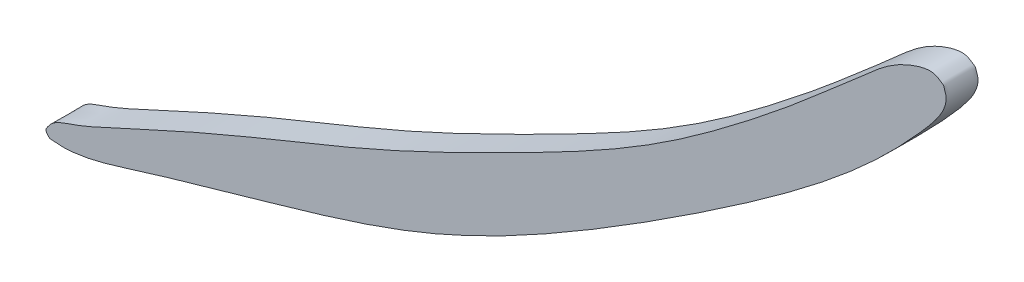
ISO-10303-21;
HEADER;
FILE_DESCRIPTION(('STEP AP214'),'2;1');
FILE_NAME('part.step','',(''),(''),'','','');
FILE_SCHEMA(('AUTOMOTIVE_DESIGN { 1 0 10303 214 1 1 1 1 }'));
ENDSEC;
DATA;
#1=APPLICATION_CONTEXT('core data for automotive mechanical design processes');
#2=APPLICATION_PROTOCOL_DEFINITION('international standard','automotive_design',2000,#1);
#3=PRODUCT_CONTEXT('',#1,'mechanical');
#4=PRODUCT('Part','Part','',(#3));
#5=PRODUCT_RELATED_PRODUCT_CATEGORY('part','',(#4));
#6=PRODUCT_DEFINITION_FORMATION('','',#4);
#7=PRODUCT_DEFINITION_CONTEXT('part definition',#1,'design');
#8=PRODUCT_DEFINITION('design','',#6,#7);
#9=PRODUCT_DEFINITION_SHAPE('','',#8);
#10=(LENGTH_UNIT() NAMED_UNIT(*) SI_UNIT(.MILLI.,.METRE.));
#11=(NAMED_UNIT(*) PLANE_ANGLE_UNIT() SI_UNIT($,.RADIAN.));
#12=(NAMED_UNIT(*) SI_UNIT($,.STERADIAN.) SOLID_ANGLE_UNIT());
#13=UNCERTAINTY_MEASURE_WITH_UNIT(LENGTH_MEASURE(1.E-05),#10,'distance_accuracy_value','');
#14=(GEOMETRIC_REPRESENTATION_CONTEXT(3) GLOBAL_UNCERTAINTY_ASSIGNED_CONTEXT((#13)) GLOBAL_UNIT_ASSIGNED_CONTEXT((#10,
#11,#12)) REPRESENTATION_CONTEXT('',''));
#15=CARTESIAN_POINT('',(0.,0.,0.));
#16=DIRECTION('',(0.,0.,1.));
#17=DIRECTION('',(1.,0.,0.));
#18=AXIS2_PLACEMENT_3D('',#15,#16,#17);
#19=CARTESIAN_POINT('',(-123.346581771939,-122.23914203334,116.));
#20=CARTESIAN_POINT('',(-123.350670343101,-122.327703271514,116.));
#21=CARTESIAN_POINT('',(-123.336388516588,-122.411762130704,116.));
#22=CARTESIAN_POINT('',(-123.287464628301,-122.576831523646,116.));
#23=CARTESIAN_POINT('',(-123.253093486007,-122.65539031784,116.));
#24=CARTESIAN_POINT('',(-123.173885785859,-122.80830883089,116.));
#25=CARTESIAN_POINT('',(-123.129447112048,-122.882204227449,116.));
#26=CARTESIAN_POINT('',(-123.036707190821,-123.02695455236,116.));
#27=CARTESIAN_POINT('',(-122.988741334589,-123.098289940944,116.));
#28=CARTESIAN_POINT('',(-122.834851360942,-123.305785755107,116.));
#29=CARTESIAN_POINT('',(-122.721297936182,-123.436081940772,116.));
#30=CARTESIAN_POINT('',(-122.434997912115,-123.631298713097,116.));
#31=CARTESIAN_POINT('',(-122.265674632005,-123.678189608886,116.));
#32=CARTESIAN_POINT('',(-121.924883098179,-123.717548437132,116.));
#33=CARTESIAN_POINT('',(-121.752270603344,-123.718239099941,116.));
#34=CARTESIAN_POINT('',(-121.408358842271,-123.73066184266,116.));
#35=CARTESIAN_POINT('',(-121.236576322802,-123.740488667375,116.));
#36=CARTESIAN_POINT('',(-120.721475103336,-123.77510655191,116.));
#37=CARTESIAN_POINT('',(-120.378627969949,-123.805971108741,116.));
#38=CARTESIAN_POINT('',(-119.691974420407,-123.854482816524,116.));
#39=CARTESIAN_POINT('',(-119.348198733799,-123.869022894388,116.));
#40=CARTESIAN_POINT('',(-118.660925144626,-123.87015771514,116.));
#41=CARTESIAN_POINT('',(-118.317073389005,-123.859046888251,116.));
#42=CARTESIAN_POINT('',(-117.28673570928,-123.801370532143,116.));
#43=CARTESIAN_POINT('',(-116.602703619699,-123.732486508648,116.));
#44=CARTESIAN_POINT('',(-114.554559908244,-123.483771012516,116.));
#45=CARTESIAN_POINT('',(-113.198845914573,-123.251110754615,116.));
#46=CARTESIAN_POINT('',(-110.512016833612,-122.660235640272,116.));
#47=CARTESIAN_POINT('',(-109.184764856665,-122.305605328689,116.));
#48=CARTESIAN_POINT('',(-106.541294125532,-121.555937325594,116.));
#49=CARTESIAN_POINT('',(-105.225646529032,-121.158628308524,116.));
#50=CARTESIAN_POINT('',(-102.596628573702,-120.356524905198,116.));
#51=CARTESIAN_POINT('',(-101.283536397662,-119.950853856829,116.));
#52=CARTESIAN_POINT('',(-97.3441452776747,-118.734212578666,116.));
#53=CARTESIAN_POINT('',(-94.7162362781622,-117.928287131128,116.));
#54=CARTESIAN_POINT('',(-81.549164173435,-113.991081891313,116.));
#55=CARTESIAN_POINT('',(-70.9379279472959,-111.104289211834,116.));
#56=CARTESIAN_POINT('',(-55.1142568095192,-106.465629398409,116.));
#57=CARTESIAN_POINT('',(-49.8556322882397,-104.867574970996,116.));
#58=CARTESIAN_POINT('',(-42.0291065031374,-102.27070028095,116.));
#59=CARTESIAN_POINT('',(-39.4306287812687,-101.371356725992,116.));
#60=CARTESIAN_POINT('',(-34.2608577594214,-99.4842284766356,116.));
#61=CARTESIAN_POINT('',(-31.6929906236804,-98.4968024491772,116.));
#62=CARTESIAN_POINT('',(-26.599613025675,-96.4285334967114,116.));
#63=CARTESIAN_POINT('',(-24.0733382933696,-95.347323859828,116.));
#64=CARTESIAN_POINT('',(-19.0600165065119,-93.094444940783,116.));
#65=CARTESIAN_POINT('',(-16.5728687351835,-91.9230079130995,116.));
#66=CARTESIAN_POINT('',(-11.6326800832874,-89.5014828282418,116.));
#67=CARTESIAN_POINT('',(-9.18055266770574,-88.252098211809,116.));
#68=CARTESIAN_POINT('',(-4.31220912328322,-85.692445435984,116.));
#69=CARTESIAN_POINT('',(-1.89492991195997,-84.3817720636148,116.));
#70=CARTESIAN_POINT('',(5.31414605134367,-80.3716661785096,116.));
#71=CARTESIAN_POINT('',(10.0652562688566,-77.5938334129924,116.));
#72=CARTESIAN_POINT('',(19.4840933609413,-71.9108196641323,116.));
#73=CARTESIAN_POINT('',(24.1503159816519,-69.0023595271135,116.));
#74=CARTESIAN_POINT('',(33.4146540563922,-63.0798738095772,116.));
#75=CARTESIAN_POINT('',(38.0137479963899,-60.0673648727584,116.));
#76=CARTESIAN_POINT('',(44.8633306807719,-55.4725616967299,116.));
#77=CARTESIAN_POINT('',(47.1382528947039,-53.9281390968016,116.));
#78=CARTESIAN_POINT('',(51.669100973916,-50.809849741976,116.));
#79=CARTESIAN_POINT('',(53.9255813178719,-49.2353229692718,116.));
#80=CARTESIAN_POINT('',(60.6508910223398,-44.4604403235639,116.));
#81=CARTESIAN_POINT('',(65.0788666773657,-41.2105782349411,116.));
#82=CARTESIAN_POINT('',(73.7406382237729,-34.4780829212687,116.));
#83=CARTESIAN_POINT('',(77.9719874357884,-30.9925167627059,116.));
#84=CARTESIAN_POINT('',(84.0810278104936,-25.4788871459378,116.));
#85=CARTESIAN_POINT('',(86.0779875164423,-23.593795714443,116.));
#86=CARTESIAN_POINT('',(89.9887457354067,-19.7239241659676,116.));
#87=CARTESIAN_POINT('',(91.9034816866435,-17.736769459996,116.));
#88=CARTESIAN_POINT('',(94.7140291735318,-14.6940828435966,116.));
#89=CARTESIAN_POINT('',(95.6414242492991,-13.6719987139001,116.));
#90=CARTESIAN_POINT('',(97.0101142089785,-12.1202584928693,116.));
#91=CARTESIAN_POINT('',(97.4630114214409,-11.6002426009153,116.));
#92=CARTESIAN_POINT('',(98.357243463853,-10.5506038081857,116.));
#93=CARTESIAN_POINT('',(98.7985931901557,-10.0209932845646,116.));
#94=CARTESIAN_POINT('',(99.6578682556959,-8.94230926825586,116.));
#95=CARTESIAN_POINT('',(100.077393779527,-8.39456534475486,116.));
#96=CARTESIAN_POINT('',(100.675738563885,-7.54723897202339,116.));
#97=CARTESIAN_POINT('',(100.869730139774,-7.26026297024299,116.));
#98=CARTESIAN_POINT('',(101.242514588653,-6.67368259422813,116.));
#99=CARTESIAN_POINT('',(101.421781904919,-6.37329795197232,116.));
#100=CARTESIAN_POINT('',(101.922969415348,-5.45849154003903,116.));
#101=CARTESIAN_POINT('',(102.209044058249,-4.82773522568489,116.));
#102=CARTESIAN_POINT('',(102.521924590601,-3.83108007929206,116.));
#103=CARTESIAN_POINT('',(102.607907298514,-3.48912428143059,116.));
#104=CARTESIAN_POINT('',(102.716281198935,-2.80340583972635,116.));
#105=CARTESIAN_POINT('',(102.740461684608,-2.45772674820018,116.));
#106=CARTESIAN_POINT('',(102.69049753289,-1.93110415019487,116.));
#107=CARTESIAN_POINT('',(102.657562147584,-1.75699665338924,116.));
#108=CARTESIAN_POINT('',(102.568933615985,-1.41790010971189,116.));
#109=CARTESIAN_POINT('',(102.513165539954,-1.25156339762478,116.));
#110=CARTESIAN_POINT('',(102.398992618676,-0.919629303133802,116.));
#111=CARTESIAN_POINT('',(102.343247609362,-0.753286123317557,116.));
#112=CARTESIAN_POINT('',(102.270241151147,-0.50079609567503,116.));
#113=CARTESIAN_POINT('',(102.246813766136,-0.416366171231397,116.));
#114=CARTESIAN_POINT('',(102.198735935725,-0.247906972511253,116.));
#115=CARTESIAN_POINT('',(102.173679119711,-0.16403586766099,116.));
#116=CARTESIAN_POINT('',(102.10477226912,-0.00291244205729064,116.));
#117=CARTESIAN_POINT('',(102.059084153302,0.0733705355731589,116.));
#118=CARTESIAN_POINT('',(101.94641318996,0.205086146646933,116.));
#119=CARTESIAN_POINT('',(101.879881681318,0.263340934956862,116.));
#120=CARTESIAN_POINT('',(101.671476302958,0.422465288487987,116.));
#121=CARTESIAN_POINT('',(101.522391185208,0.513482365110699,116.));
#122=CARTESIAN_POINT('',(101.226731768766,0.699244033254578,116.));
#123=CARTESIAN_POINT('',(101.08096751975,0.795334725475329,116.));
#124=CARTESIAN_POINT('',(100.78576295919,0.981321147013895,116.));
#125=CARTESIAN_POINT('',(100.635820826836,1.07023489922442,116.));
#126=CARTESIAN_POINT('',(100.328219137469,1.23460731628296,116.));
#127=CARTESIAN_POINT('',(100.16933118882,1.31081998955095,116.));
#128=CARTESIAN_POINT('',(99.8448643301852,1.43200785428351,116.));
#129=CARTESIAN_POINT('',(99.6793521984889,1.47770856542459,116.));
#130=CARTESIAN_POINT('',(99.1742426514521,1.57586789959678,116.));
#131=CARTESIAN_POINT('',(98.8231454750102,1.58996918045501,116.));
#132=CARTESIAN_POINT('',(98.1319305510002,1.56258910020187,116.));
#133=CARTESIAN_POINT('',(97.7890910372581,1.52150123298196,116.));
#134=CARTESIAN_POINT('',(97.1060678287052,1.41303755492492,116.));
#135=CARTESIAN_POINT('',(96.7655720443355,1.34270270373661,116.));
#136=CARTESIAN_POINT('',(95.7611814020566,1.09472292237353,116.));
#137=CARTESIAN_POINT('',(95.1080838506964,0.884365625549629,116.));
#138=CARTESIAN_POINT('',(93.8188001618763,0.417480012913218,116.));
#139=CARTESIAN_POINT('',(93.1841307739104,0.156810714560129,116.));
#140=CARTESIAN_POINT('',(91.9319492862757,-0.411370179805628,116.));
#141=CARTESIAN_POINT('',(91.3126790679563,-0.719931069822434,116.));
#142=CARTESIAN_POINT('',(90.107733711017,-1.37733356436989,116.));
#143=CARTESIAN_POINT('',(89.5206719276991,-1.72689423541155,116.));
#144=CARTESIAN_POINT('',(87.8055917078289,-2.8379818672111,116.));
#145=CARTESIAN_POINT('',(86.7226821422981,-3.66056595976179,116.));
#146=CARTESIAN_POINT('',(84.6175483386729,-5.38787479594283,116.));
#147=CARTESIAN_POINT('',(83.5954213062433,-6.29273111234233,116.));
#148=CARTESIAN_POINT('',(81.5593292380886,-8.11349141929519,116.));
#149=CARTESIAN_POINT('',(80.5424706408766,-9.02543623577969,116.));
#150=CARTESIAN_POINT('',(78.4927219372392,-10.8308182624379,116.));
#151=CARTESIAN_POINT('',(77.4587935291318,-11.723167411233,116.));
#152=CARTESIAN_POINT('',(75.3768089775032,-13.4917285078646,116.));
#153=CARTESIAN_POINT('',(74.3291871285381,-14.3682931808088,116.));
#154=CARTESIAN_POINT('',(72.2501090558247,-16.1403169251124,116.));
#155=CARTESIAN_POINT('',(71.2231757497415,-17.0411021195127,116.));
#156=CARTESIAN_POINT('',(69.6826728388279,-18.392129940139,116.));
#157=CARTESIAN_POINT('',(69.168738630747,-18.8419715496411,116.));
#158=CARTESIAN_POINT('',(68.1353383191007,-19.7352576692745,116.));
#159=CARTESIAN_POINT('',(67.6161683482654,-20.1790446281209,116.));
#160=CARTESIAN_POINT('',(66.0533163296915,-21.5042278783,116.));
#161=CARTESIAN_POINT('',(65.0051469751659,-22.3802173903402,116.));
#162=CARTESIAN_POINT('',(61.8545163515504,-24.9999636050128,116.));
#163=CARTESIAN_POINT('',(59.7393724176656,-26.7279516559802,116.));
#164=CARTESIAN_POINT('',(55.4728450759091,-30.13836990708,116.));
#165=CARTESIAN_POINT('',(53.3240505606793,-31.8240546904564,116.));
#166=CARTESIAN_POINT('',(48.9950642885311,-35.1559537380183,116.));
#167=CARTESIAN_POINT('',(46.8145151475727,-36.8028070795774,116.));
#168=CARTESIAN_POINT('',(42.4207391228446,-40.0492968294964,116.));
#169=CARTESIAN_POINT('',(40.2075747948456,-41.6487758066096,116.));
#170=CARTESIAN_POINT('',(35.7321240048053,-44.776007969458,116.));
#171=CARTESIAN_POINT('',(33.4700545331157,-46.3040779941295,116.));
#172=CARTESIAN_POINT('',(28.8952863799001,-49.2862916920797,116.));
#173=CARTESIAN_POINT('',(26.5815226060628,-50.7408219260416,116.));
#174=CARTESIAN_POINT('',(21.9092997889222,-53.5752165937803,116.));
#175=CARTESIAN_POINT('',(19.5520445695842,-54.9545580360093,116.));
#176=CARTESIAN_POINT('',(14.8008642387381,-57.6475871232541,116.));
#177=CARTESIAN_POINT('',(12.4070662190796,-58.9615023135948,116.));
#178=CARTESIAN_POINT('',(7.59308180780003,-61.5420869370869,116.));
#179=CARTESIAN_POINT('',(5.17292040947068,-62.8089588712768,116.));
#180=CARTESIAN_POINT('',(0.322336091439819,-65.3236471989884,116.));
#181=CARTESIAN_POINT('',(-2.1076050239656,-66.5717713116194,116.));
#182=CARTESIAN_POINT('',(-9.4119340668177,-70.2873752002493,116.));
#183=CARTESIAN_POINT('',(-14.3000061576305,-72.7277158343378,116.));
#184=CARTESIAN_POINT('',(-24.1164617418414,-77.5284494399429,116.));
#185=CARTESIAN_POINT('',(-29.0427889757935,-79.8877936215159,116.));
#186=CARTESIAN_POINT('',(-36.4839559968026,-83.3092680190158,116.));
#187=CARTESIAN_POINT('',(-38.9737650449766,-84.4283485703715,116.));
#188=CARTESIAN_POINT('',(-43.9753888904251,-86.6164925655715,116.));
#189=CARTESIAN_POINT('',(-46.4863985410165,-87.6873860361069,116.));
#190=CARTESIAN_POINT('',(-54.0391872432138,-90.8551542951303,116.));
#191=CARTESIAN_POINT('',(-59.1009959232376,-92.9065035223931,116.));
#192=CARTESIAN_POINT('',(-69.2193347981436,-97.0211995034562,116.));
#193=CARTESIAN_POINT('',(-74.2748689338954,-99.0869613394609,116.));
#194=CARTESIAN_POINT('',(-84.326525044298,-103.358940330601,116.));
#195=CARTESIAN_POINT('',(-89.3193560608554,-105.573825463741,116.));
#196=CARTESIAN_POINT('',(-96.7795003064204,-108.960278372394,116.));
#197=CARTESIAN_POINT('',(-99.2614577772685,-110.099545406159,116.));
#198=CARTESIAN_POINT('',(-102.982750012228,-111.811991468125,116.));
#199=CARTESIAN_POINT('',(-104.2230182603,-112.383160089924,116.));
#200=CARTESIAN_POINT('',(-106.704352007319,-113.523764112485,116.));
#201=CARTESIAN_POINT('',(-107.944513711635,-114.095174214663,116.));
#202=CARTESIAN_POINT('',(-110.430588895766,-115.225418862291,116.));
#203=CARTESIAN_POINT('',(-111.677873268579,-115.780732927311,116.));
#204=CARTESIAN_POINT('',(-113.56678836131,-116.570900819762,116.));
#205=CARTESIAN_POINT('',(-114.19932108741,-116.827431871448,116.));
#206=CARTESIAN_POINT('',(-115.473192277892,-117.319628609487,116.));
#207=CARTESIAN_POINT('',(-116.115212633367,-117.553610631258,116.));
#208=CARTESIAN_POINT('',(-117.406950871695,-118.002788014443,116.));
#209=CARTESIAN_POINT('',(-118.055052925249,-118.221969853928,116.));
#210=CARTESIAN_POINT('',(-119.33365060461,-118.702965932384,116.));
#211=CARTESIAN_POINT('',(-119.966550458392,-118.958958547064,116.));
#212=CARTESIAN_POINT('',(-120.876021111634,-119.439511230693,116.));
#213=CARTESIAN_POINT('',(-121.173992376959,-119.618630413279,116.));
#214=CARTESIAN_POINT('',(-121.736638450103,-120.029006877631,116.));
#215=CARTESIAN_POINT('',(-121.992867982821,-120.259500440177,116.));
#216=CARTESIAN_POINT('',(-122.461673227506,-120.764509889234,116.));
#217=CARTESIAN_POINT('',(-122.676977178272,-121.037736954846,116.));
#218=CARTESIAN_POINT('',(-122.981435559348,-121.46060921075,116.));
#219=CARTESIAN_POINT('',(-123.082213945605,-121.602028858218,116.));
#220=CARTESIAN_POINT('',(-123.260034620543,-121.900370310435,116.));
#221=CARTESIAN_POINT('',(-123.338404629615,-122.062019556993,116.));
#222=CARTESIAN_POINT('',(-123.346581771939,-122.23914203334,116.));
#223=B_SPLINE_CURVE_WITH_KNOTS('',3,(#19,#20,#21,#22,#23,#24,#25,#26,#27,#28,#29,#30,#31,#32,
#33,#34,#35,#36,#37,#38,#39,#40,#41,#42,#43,#44,#45,#46,#47,#48,#49,#50,#51,#52,#53,#54,#55,#56,
#57,#58,#59,#60,#61,#62,#63,#64,#65,#66,#67,#68,#69,#70,#71,#72,#73,#74,#75,#76,#77,#78,#79,#80,
#81,#82,#83,#84,#85,#86,#87,#88,#89,#90,#91,#92,#93,#94,#95,#96,#97,#98,#99,#100,#101,#102,#103,
#104,#105,#106,#107,#108,#109,#110,#111,#112,#113,#114,#115,#116,#117,#118,#119,#120,#121,#122,
#123,#124,#125,#126,#127,#128,#129,#130,#131,#132,#133,#134,#135,#136,#137,#138,#139,#140,#141,
#142,#143,#144,#145,#146,#147,#148,#149,#150,#151,#152,#153,#154,#155,#156,#157,#158,#159,#160,
#161,#162,#163,#164,#165,#166,#167,#168,#169,#170,#171,#172,#173,#174,#175,#176,#177,#178,#179,
#180,#181,#182,#183,#184,#185,#186,#187,#188,#189,#190,#191,#192,#193,#194,#195,#196,#197,#198,
#199,#200,#201,#202,#203,#204,#205,#206,#207,#208,#209,#210,#211,#212,#213,#214,#215,#216,#217,
#218,#219,#220,#221,#222),.UNSPECIFIED.,.T.,.F.,(4,2,2,2,2,2,2,2,2,2,2,2,2,2,2,2,2,2,2,2,2,2,2,
2,2,2,2,2,2,2,2,2,2,2,2,2,2,2,2,2,2,2,2,2,2,2,2,2,2,2,2,2,2,2,2,2,2,2,2,2,2,2,2,2,2,2,2,2,2,2,2,
2,2,2,2,2,2,2,2,2,2,2,2,2,2,2,2,2,2,2,2,2,2,2,2,2,2,2,2,2,2,4),(0.,0.000488281249999889,
0.000976562499999889,0.00146484374999989,0.001953125,0.00292968749999989,0.00390624999999978,
0.00488281249999978,0.00585937499999967,0.00781249999999956,0.00976562499999956,
0.0117187499999996,0.0156249999999994,0.0234374999999992,0.0312499999999991,0.0390624999999989,
0.0468749999999988,0.0624999999999982,0.124999999999997,0.156249999999996,0.171874999999996,
0.187499999999995,0.203124999999995,0.218749999999995,0.234374999999994,0.249999999999994,
0.281249999999993,0.312499999999993,0.343749999999992,0.359374999999992,0.374999999999991,
0.406249999999991,0.43749999999999,0.45312499999999,0.468749999999989,0.476562499999989,
0.480468749999989,0.484374999999989,0.488281249999989,0.490234374999989,0.492187499999989,
0.496093749999989,0.498046874999989,0.499999999999989,0.500976562499989,0.501953124999989,
0.502929687499989,0.503417968749989,0.503906249999989,0.504394531249989,0.504882812499988,
0.505859374999989,0.506835937499989,0.507812499999989,0.508789062499989,0.509765624999989,
0.511718749999989,0.513671874999989,0.515624999999989,0.519531249999989,0.523437499999989,
0.527343749999989,0.531249999999989,0.53906249999999,0.54687499999999,0.55468749999999,
0.56249999999999,0.57031249999999,0.578124999999991,0.582031249999991,0.585937499999991,
0.593749999999991,0.609374999999991,0.624999999999992,0.640624999999992,0.656249999999992,
0.671874999999993,0.687499999999993,0.703124999999993,0.718749999999994,0.734374999999994,
0.749999999999994,0.781249999999995,0.812499999999996,0.828124999999996,0.843749999999996,
0.874999999999997,0.906249999999998,0.937499999999998,0.953124999999999,0.960937499999999,
0.968749999999999,0.976562499999999,0.980468749999999,0.984375,0.98828125,0.9921875,0.994140625,
0.99609375,0.998046875,0.9990234375,1.),.UNSPECIFIED.);
#224=DIRECTION('',(0.,0.,-1.));
#225=VECTOR('',#224,1.);
#226=SURFACE_OF_LINEAR_EXTRUSION('',#223,#225);
#227=CARTESIAN_POINT('',(-123.346581771939,-122.23914203334,116.));
#228=CARTESIAN_POINT('',(-123.338404629615,-122.062019556993,116.));
#229=CARTESIAN_POINT('',(-123.260034620543,-121.900370310435,116.));
#230=CARTESIAN_POINT('',(-123.082213945605,-121.602028858218,116.));
#231=CARTESIAN_POINT('',(-122.981435559348,-121.46060921075,116.));
#232=CARTESIAN_POINT('',(-122.676977178272,-121.037736954846,116.));
#233=CARTESIAN_POINT('',(-122.461673227506,-120.764509889234,116.));
#234=CARTESIAN_POINT('',(-121.992867982821,-120.259500440177,116.));
#235=CARTESIAN_POINT('',(-121.736638450103,-120.029006877631,116.));
#236=CARTESIAN_POINT('',(-121.173992376959,-119.618630413279,116.));
#237=CARTESIAN_POINT('',(-120.876021111634,-119.439511230693,116.));
#238=CARTESIAN_POINT('',(-119.966550458392,-118.958958547064,116.));
#239=CARTESIAN_POINT('',(-119.33365060461,-118.702965932384,116.));
#240=CARTESIAN_POINT('',(-118.055052925249,-118.221969853928,116.));
#241=CARTESIAN_POINT('',(-117.406950871695,-118.002788014443,116.));
#242=CARTESIAN_POINT('',(-116.115212633367,-117.553610631258,116.));
#243=CARTESIAN_POINT('',(-115.473192277892,-117.319628609487,116.));
#244=CARTESIAN_POINT('',(-114.19932108741,-116.827431871448,116.));
#245=CARTESIAN_POINT('',(-113.56678836131,-116.570900819762,116.));
#246=CARTESIAN_POINT('',(-111.677873268579,-115.780732927311,116.));
#247=CARTESIAN_POINT('',(-110.430588895766,-115.225418862291,116.));
#248=CARTESIAN_POINT('',(-107.944513711635,-114.095174214663,116.));
#249=CARTESIAN_POINT('',(-106.704352007319,-113.523764112485,116.));
#250=CARTESIAN_POINT('',(-104.2230182603,-112.383160089924,116.));
#251=CARTESIAN_POINT('',(-102.982750012228,-111.811991468125,116.));
#252=CARTESIAN_POINT('',(-99.2614577772685,-110.099545406159,116.));
#253=CARTESIAN_POINT('',(-96.7795003064204,-108.960278372394,116.));
#254=CARTESIAN_POINT('',(-89.3193560608554,-105.573825463741,116.));
#255=CARTESIAN_POINT('',(-84.326525044298,-103.358940330601,116.));
#256=CARTESIAN_POINT('',(-74.2748689338954,-99.0869613394609,116.));
#257=CARTESIAN_POINT('',(-69.2193347981436,-97.0211995034562,116.));
#258=CARTESIAN_POINT('',(-59.1009959232376,-92.9065035223931,116.));
#259=CARTESIAN_POINT('',(-54.0391872432138,-90.8551542951303,116.));
#260=CARTESIAN_POINT('',(-46.4863985410165,-87.6873860361069,116.));
#261=CARTESIAN_POINT('',(-43.9753888904251,-86.6164925655715,116.));
#262=CARTESIAN_POINT('',(-38.9737650449766,-84.4283485703715,116.));
#263=CARTESIAN_POINT('',(-36.4839559968026,-83.3092680190158,116.));
#264=CARTESIAN_POINT('',(-29.0427889757935,-79.8877936215159,116.));
#265=CARTESIAN_POINT('',(-24.1164617418414,-77.5284494399429,116.));
#266=CARTESIAN_POINT('',(-14.3000061576305,-72.7277158343378,116.));
#267=CARTESIAN_POINT('',(-9.4119340668177,-70.2873752002493,116.));
#268=CARTESIAN_POINT('',(-2.1076050239656,-66.5717713116194,116.));
#269=CARTESIAN_POINT('',(0.322336091439819,-65.3236471989884,116.));
#270=CARTESIAN_POINT('',(5.17292040947068,-62.8089588712768,116.));
#271=CARTESIAN_POINT('',(7.59308180780003,-61.5420869370869,116.));
#272=CARTESIAN_POINT('',(12.4070662190796,-58.9615023135948,116.));
#273=CARTESIAN_POINT('',(14.8008642387381,-57.6475871232541,116.));
#274=CARTESIAN_POINT('',(19.5520445695842,-54.9545580360093,116.));
#275=CARTESIAN_POINT('',(21.9092997889222,-53.5752165937803,116.));
#276=CARTESIAN_POINT('',(26.5815226060628,-50.7408219260416,116.));
#277=CARTESIAN_POINT('',(28.8952863799001,-49.2862916920797,116.));
#278=CARTESIAN_POINT('',(33.4700545331157,-46.3040779941295,116.));
#279=CARTESIAN_POINT('',(35.7321240048053,-44.776007969458,116.));
#280=CARTESIAN_POINT('',(40.2075747948456,-41.6487758066096,116.));
#281=CARTESIAN_POINT('',(42.4207391228446,-40.0492968294964,116.));
#282=CARTESIAN_POINT('',(46.8145151475727,-36.8028070795774,116.));
#283=CARTESIAN_POINT('',(48.9950642885311,-35.1559537380183,116.));
#284=CARTESIAN_POINT('',(53.3240505606793,-31.8240546904564,116.));
#285=CARTESIAN_POINT('',(55.4728450759091,-30.13836990708,116.));
#286=CARTESIAN_POINT('',(59.7393724176656,-26.7279516559802,116.));
#287=CARTESIAN_POINT('',(61.8545163515504,-24.9999636050128,116.));
#288=CARTESIAN_POINT('',(65.0051469751659,-22.3802173903402,116.));
#289=CARTESIAN_POINT('',(66.0533163296915,-21.5042278783,116.));
#290=CARTESIAN_POINT('',(67.6161683482654,-20.1790446281209,116.));
#291=CARTESIAN_POINT('',(68.1353383191007,-19.7352576692745,116.));
#292=CARTESIAN_POINT('',(69.168738630747,-18.8419715496411,116.));
#293=CARTESIAN_POINT('',(69.6826728388279,-18.392129940139,116.));
#294=CARTESIAN_POINT('',(71.2231757497415,-17.0411021195127,116.));
#295=CARTESIAN_POINT('',(72.2501090558247,-16.1403169251124,116.));
#296=CARTESIAN_POINT('',(74.3291871285381,-14.3682931808088,116.));
#297=CARTESIAN_POINT('',(75.3768089775032,-13.4917285078646,116.));
#298=CARTESIAN_POINT('',(77.4587935291318,-11.723167411233,116.));
#299=CARTESIAN_POINT('',(78.4927219372392,-10.8308182624379,116.));
#300=CARTESIAN_POINT('',(80.5424706408766,-9.02543623577969,116.));
#301=CARTESIAN_POINT('',(81.5593292380886,-8.11349141929519,116.));
#302=CARTESIAN_POINT('',(83.5954213062433,-6.29273111234233,116.));
#303=CARTESIAN_POINT('',(84.6175483386729,-5.38787479594283,116.));
#304=CARTESIAN_POINT('',(86.7226821422981,-3.66056595976179,116.));
#305=CARTESIAN_POINT('',(87.8055917078289,-2.8379818672111,116.));
#306=CARTESIAN_POINT('',(89.5206719276991,-1.72689423541155,116.));
#307=CARTESIAN_POINT('',(90.107733711017,-1.37733356436989,116.));
#308=CARTESIAN_POINT('',(91.3126790679563,-0.719931069822434,116.));
#309=CARTESIAN_POINT('',(91.9319492862757,-0.411370179805628,116.));
#310=CARTESIAN_POINT('',(93.1841307739104,0.156810714560129,116.));
#311=CARTESIAN_POINT('',(93.8188001618763,0.417480012913218,116.));
#312=CARTESIAN_POINT('',(95.1080838506964,0.884365625549629,116.));
#313=CARTESIAN_POINT('',(95.7611814020566,1.09472292237353,116.));
#314=CARTESIAN_POINT('',(96.7655720443355,1.34270270373661,116.));
#315=CARTESIAN_POINT('',(97.1060678287052,1.41303755492492,116.));
#316=CARTESIAN_POINT('',(97.7890910372581,1.52150123298196,116.));
#317=CARTESIAN_POINT('',(98.1319305510002,1.56258910020187,116.));
#318=CARTESIAN_POINT('',(98.8231454750102,1.58996918045501,116.));
#319=CARTESIAN_POINT('',(99.1742426514521,1.57586789959678,116.));
#320=CARTESIAN_POINT('',(99.6793521984889,1.47770856542459,116.));
#321=CARTESIAN_POINT('',(99.8448643301852,1.43200785428351,116.));
#322=CARTESIAN_POINT('',(100.16933118882,1.31081998955095,116.));
#323=CARTESIAN_POINT('',(100.328219137469,1.23460731628296,116.));
#324=CARTESIAN_POINT('',(100.635820826836,1.07023489922442,116.));
#325=CARTESIAN_POINT('',(100.78576295919,0.981321147013895,116.));
#326=CARTESIAN_POINT('',(101.08096751975,0.795334725475329,116.));
#327=CARTESIAN_POINT('',(101.226731768766,0.699244033254578,116.));
#328=CARTESIAN_POINT('',(101.522391185208,0.513482365110699,116.));
#329=CARTESIAN_POINT('',(101.671476302958,0.422465288487987,116.));
#330=CARTESIAN_POINT('',(101.879881681318,0.263340934956862,116.));
#331=CARTESIAN_POINT('',(101.94641318996,0.205086146646933,116.));
#332=CARTESIAN_POINT('',(102.059084153302,0.0733705355731589,116.));
#333=CARTESIAN_POINT('',(102.10477226912,-0.00291244205729064,116.));
#334=CARTESIAN_POINT('',(102.173679119711,-0.16403586766099,116.));
#335=CARTESIAN_POINT('',(102.198735935725,-0.247906972511253,116.));
#336=CARTESIAN_POINT('',(102.246813766136,-0.416366171231397,116.));
#337=CARTESIAN_POINT('',(102.270241151147,-0.50079609567503,116.));
#338=CARTESIAN_POINT('',(102.343247609362,-0.753286123317557,116.));
#339=CARTESIAN_POINT('',(102.398992618676,-0.919629303133802,116.));
#340=CARTESIAN_POINT('',(102.513165539954,-1.25156339762478,116.));
#341=CARTESIAN_POINT('',(102.568933615985,-1.41790010971189,116.));
#342=CARTESIAN_POINT('',(102.657562147584,-1.75699665338924,116.));
#343=CARTESIAN_POINT('',(102.69049753289,-1.93110415019487,116.));
#344=CARTESIAN_POINT('',(102.740461684608,-2.45772674820018,116.));
#345=CARTESIAN_POINT('',(102.716281198935,-2.80340583972635,116.));
#346=CARTESIAN_POINT('',(102.607907298514,-3.48912428143059,116.));
#347=CARTESIAN_POINT('',(102.521924590601,-3.83108007929206,116.));
#348=CARTESIAN_POINT('',(102.209044058249,-4.82773522568489,116.));
#349=CARTESIAN_POINT('',(101.922969415348,-5.45849154003903,116.));
#350=CARTESIAN_POINT('',(101.421781904919,-6.37329795197232,116.));
#351=CARTESIAN_POINT('',(101.242514588653,-6.67368259422813,116.));
#352=CARTESIAN_POINT('',(100.869730139774,-7.26026297024299,116.));
#353=CARTESIAN_POINT('',(100.675738563885,-7.54723897202339,116.));
#354=CARTESIAN_POINT('',(100.077393779527,-8.39456534475486,116.));
#355=CARTESIAN_POINT('',(99.6578682556959,-8.94230926825586,116.));
#356=CARTESIAN_POINT('',(98.7985931901557,-10.0209932845646,116.));
#357=CARTESIAN_POINT('',(98.357243463853,-10.5506038081857,116.));
#358=CARTESIAN_POINT('',(97.4630114214409,-11.6002426009153,116.));
#359=CARTESIAN_POINT('',(97.0101142089785,-12.1202584928693,116.));
#360=CARTESIAN_POINT('',(95.6414242492991,-13.6719987139001,116.));
#361=CARTESIAN_POINT('',(94.7140291735318,-14.6940828435966,116.));
#362=CARTESIAN_POINT('',(91.9034816866435,-17.736769459996,116.));
#363=CARTESIAN_POINT('',(89.9887457354067,-19.7239241659676,116.));
#364=CARTESIAN_POINT('',(86.0779875164423,-23.593795714443,116.));
#365=CARTESIAN_POINT('',(84.0810278104936,-25.4788871459378,116.));
#366=CARTESIAN_POINT('',(77.9719874357884,-30.9925167627059,116.));
#367=CARTESIAN_POINT('',(73.7406382237729,-34.4780829212687,116.));
#368=CARTESIAN_POINT('',(65.0788666773657,-41.2105782349411,116.));
#369=CARTESIAN_POINT('',(60.6508910223398,-44.4604403235639,116.));
#370=CARTESIAN_POINT('',(53.9255813178719,-49.2353229692718,116.));
#371=CARTESIAN_POINT('',(51.669100973916,-50.809849741976,116.));
#372=CARTESIAN_POINT('',(47.1382528947039,-53.9281390968016,116.));
#373=CARTESIAN_POINT('',(44.8633306807719,-55.4725616967299,116.));
#374=CARTESIAN_POINT('',(38.0137479963899,-60.0673648727584,116.));
#375=CARTESIAN_POINT('',(33.4146540563922,-63.0798738095772,116.));
#376=CARTESIAN_POINT('',(24.1503159816519,-69.0023595271135,116.));
#377=CARTESIAN_POINT('',(19.4840933609413,-71.9108196641323,116.));
#378=CARTESIAN_POINT('',(10.0652562688566,-77.5938334129924,116.));
#379=CARTESIAN_POINT('',(5.31414605134367,-80.3716661785096,116.));
#380=CARTESIAN_POINT('',(-1.89492991195997,-84.3817720636148,116.));
#381=CARTESIAN_POINT('',(-4.31220912328322,-85.692445435984,116.));
#382=CARTESIAN_POINT('',(-9.18055266770574,-88.252098211809,116.));
#383=CARTESIAN_POINT('',(-11.6326800832874,-89.5014828282418,116.));
#384=CARTESIAN_POINT('',(-16.5728687351835,-91.9230079130995,116.));
#385=CARTESIAN_POINT('',(-19.0600165065119,-93.094444940783,116.));
#386=CARTESIAN_POINT('',(-24.0733382933696,-95.347323859828,116.));
#387=CARTESIAN_POINT('',(-26.599613025675,-96.4285334967114,116.));
#388=CARTESIAN_POINT('',(-31.6929906236804,-98.4968024491772,116.));
#389=CARTESIAN_POINT('',(-34.2608577594214,-99.4842284766356,116.));
#390=CARTESIAN_POINT('',(-39.4306287812687,-101.371356725992,116.));
#391=CARTESIAN_POINT('',(-42.0291065031374,-102.27070028095,116.));
#392=CARTESIAN_POINT('',(-49.8556322882397,-104.867574970996,116.));
#393=CARTESIAN_POINT('',(-55.1142568095192,-106.465629398409,116.));
#394=CARTESIAN_POINT('',(-70.9379279472959,-111.104289211834,116.));
#395=CARTESIAN_POINT('',(-81.549164173435,-113.991081891313,116.));
#396=CARTESIAN_POINT('',(-94.7162362781622,-117.928287131128,116.));
#397=CARTESIAN_POINT('',(-97.3441452776747,-118.734212578666,116.));
#398=CARTESIAN_POINT('',(-101.283536397662,-119.950853856829,116.));
#399=CARTESIAN_POINT('',(-102.596628573702,-120.356524905198,116.));
#400=CARTESIAN_POINT('',(-105.225646529032,-121.158628308524,116.));
#401=CARTESIAN_POINT('',(-106.541294125532,-121.555937325594,116.));
#402=CARTESIAN_POINT('',(-109.184764856665,-122.305605328689,116.));
#403=CARTESIAN_POINT('',(-110.512016833612,-122.660235640272,116.));
#404=CARTESIAN_POINT('',(-113.198845914573,-123.251110754615,116.));
#405=CARTESIAN_POINT('',(-114.554559908244,-123.483771012516,116.));
#406=CARTESIAN_POINT('',(-116.602703619699,-123.732486508648,116.));
#407=CARTESIAN_POINT('',(-117.28673570928,-123.801370532143,116.));
#408=CARTESIAN_POINT('',(-118.317073389005,-123.859046888251,116.));
#409=CARTESIAN_POINT('',(-118.660925144626,-123.87015771514,116.));
#410=CARTESIAN_POINT('',(-119.348198733799,-123.869022894388,116.));
#411=CARTESIAN_POINT('',(-119.691974420407,-123.854482816524,116.));
#412=CARTESIAN_POINT('',(-120.378627969949,-123.805971108741,116.));
#413=CARTESIAN_POINT('',(-120.721475103336,-123.77510655191,116.));
#414=CARTESIAN_POINT('',(-121.236576322802,-123.740488667375,116.));
#415=CARTESIAN_POINT('',(-121.408358842271,-123.73066184266,116.));
#416=CARTESIAN_POINT('',(-121.752270603344,-123.718239099941,116.));
#417=CARTESIAN_POINT('',(-121.924883098179,-123.717548437132,116.));
#418=CARTESIAN_POINT('',(-122.265674632005,-123.678189608886,116.));
#419=CARTESIAN_POINT('',(-122.434997912115,-123.631298713097,116.));
#420=CARTESIAN_POINT('',(-122.721297936182,-123.436081940772,116.));
#421=CARTESIAN_POINT('',(-122.834851360942,-123.305785755107,116.));
#422=CARTESIAN_POINT('',(-122.988741334589,-123.098289940944,116.));
#423=CARTESIAN_POINT('',(-123.036707190821,-123.02695455236,116.));
#424=CARTESIAN_POINT('',(-123.129447112048,-122.882204227449,116.));
#425=CARTESIAN_POINT('',(-123.173885785859,-122.80830883089,116.));
#426=CARTESIAN_POINT('',(-123.253093486007,-122.65539031784,116.));
#427=CARTESIAN_POINT('',(-123.287464628301,-122.576831523646,116.));
#428=CARTESIAN_POINT('',(-123.336388516588,-122.411762130704,116.));
#429=CARTESIAN_POINT('',(-123.350670343101,-122.327703271514,116.));
#430=CARTESIAN_POINT('',(-123.346581771939,-122.23914203334,116.));
#431=B_SPLINE_CURVE_WITH_KNOTS('',3,(#227,#228,#229,#230,#231,#232,#233,#234,#235,#236,#237,
#238,#239,#240,#241,#242,#243,#244,#245,#246,#247,#248,#249,#250,#251,#252,#253,#254,#255,#256,
#257,#258,#259,#260,#261,#262,#263,#264,#265,#266,#267,#268,#269,#270,#271,#272,#273,#274,#275,
#276,#277,#278,#279,#280,#281,#282,#283,#284,#285,#286,#287,#288,#289,#290,#291,#292,#293,#294,
#295,#296,#297,#298,#299,#300,#301,#302,#303,#304,#305,#306,#307,#308,#309,#310,#311,#312,#313,
#314,#315,#316,#317,#318,#319,#320,#321,#322,#323,#324,#325,#326,#327,#328,#329,#330,#331,#332,
#333,#334,#335,#336,#337,#338,#339,#340,#341,#342,#343,#344,#345,#346,#347,#348,#349,#350,#351,
#352,#353,#354,#355,#356,#357,#358,#359,#360,#361,#362,#363,#364,#365,#366,#367,#368,#369,#370,
#371,#372,#373,#374,#375,#376,#377,#378,#379,#380,#381,#382,#383,#384,#385,#386,#387,#388,#389,
#390,#391,#392,#393,#394,#395,#396,#397,#398,#399,#400,#401,#402,#403,#404,#405,#406,#407,#408,
#409,#410,#411,#412,#413,#414,#415,#416,#417,#418,#419,#420,#421,#422,#423,#424,#425,#426,#427,
#428,#429,#430),.UNSPECIFIED.,.T.,.F.,(4,2,2,2,2,2,2,2,2,2,2,2,2,2,2,2,2,2,2,2,2,2,2,2,2,2,2,2,
2,2,2,2,2,2,2,2,2,2,2,2,2,2,2,2,2,2,2,2,2,2,2,2,2,2,2,2,2,2,2,2,2,2,2,2,2,2,2,2,2,2,2,2,2,2,2,2,
2,2,2,2,2,2,2,2,2,2,2,2,2,2,2,2,2,2,2,2,2,2,2,2,2,4),(0.,0.0009765625,0.00195312500000011,
0.00390625000000011,0.00585937500000011,0.00781250000000022,0.0117187500000003,
0.0156250000000004,0.0195312500000006,0.0234375000000007,0.0312500000000008,0.039062500000001,
0.0468750000000012,0.0625000000000016,0.0937500000000022,0.125000000000003,0.156250000000004,
0.171875000000004,0.187500000000004,0.218750000000005,0.250000000000006,0.265625000000006,
0.281250000000006,0.296875000000007,0.312500000000007,0.328125000000007,0.343750000000008,
0.359375000000008,0.375000000000008,0.390625000000009,0.406250000000009,0.414062500000009,
0.417968750000009,0.421875000000009,0.42968750000001,0.43750000000001,0.44531250000001,
0.45312500000001,0.46093750000001,0.468750000000011,0.472656250000011,0.476562500000011,
0.480468750000011,0.484375000000011,0.486328125000011,0.488281250000011,0.490234375000011,
0.491210937500011,0.492187500000011,0.493164062500011,0.494140625000011,0.495117187500012,
0.495605468750011,0.496093750000011,0.496582031250011,0.497070312500011,0.498046875000011,
0.499023437500011,0.500000000000011,0.501953125000011,0.503906250000011,0.507812500000011,
0.509765625000011,0.511718750000011,0.515625000000011,0.519531250000011,0.523437500000011,
0.531250000000011,0.54687500000001,0.56250000000001,0.593750000000009,0.625000000000009,
0.640625000000008,0.656250000000008,0.687500000000007,0.718750000000007,0.750000000000006,
0.765625000000006,0.781250000000005,0.796875000000005,0.812500000000005,0.828125000000004,
0.843750000000004,0.875000000000003,0.937500000000002,0.953125000000001,0.960937500000001,
0.968750000000001,0.976562500000001,0.984375000000001,0.98828125,0.990234375,0.9921875,
0.994140625,0.9951171875,0.99609375,0.9970703125,0.998046875,0.99853515625,0.9990234375,
0.99951171875,1.),.UNSPECIFIED.);
#432=CARTESIAN_POINT('',(-123.346581771939,-122.23914203334,116.));
#433=VERTEX_POINT('',#432);
#434=EDGE_CURVE('E10',#433,#433,#431,.F.);
#435=ORIENTED_EDGE('',*,*,#434,.F.);
#436=EDGE_LOOP('',(#435));
#437=FACE_BOUND('',#436,.T.);
#438=CARTESIAN_POINT('',(-123.346581771939,-122.23914203334,108.));
#439=CARTESIAN_POINT('',(-123.350670343101,-122.327703271514,108.));
#440=CARTESIAN_POINT('',(-123.336388516588,-122.411762130704,108.));
#441=CARTESIAN_POINT('',(-123.287464628301,-122.576831523646,108.));
#442=CARTESIAN_POINT('',(-123.253093486007,-122.65539031784,108.));
#443=CARTESIAN_POINT('',(-123.173885785859,-122.80830883089,108.));
#444=CARTESIAN_POINT('',(-123.129447112048,-122.882204227449,108.));
#445=CARTESIAN_POINT('',(-123.036707190821,-123.02695455236,108.));
#446=CARTESIAN_POINT('',(-122.988741334589,-123.098289940944,108.));
#447=CARTESIAN_POINT('',(-122.834851360942,-123.305785755107,108.));
#448=CARTESIAN_POINT('',(-122.721297936182,-123.436081940772,108.));
#449=CARTESIAN_POINT('',(-122.434997912115,-123.631298713097,108.));
#450=CARTESIAN_POINT('',(-122.265674632005,-123.678189608886,108.));
#451=CARTESIAN_POINT('',(-121.924883098179,-123.717548437132,108.));
#452=CARTESIAN_POINT('',(-121.752270603344,-123.718239099941,108.));
#453=CARTESIAN_POINT('',(-121.408358842271,-123.73066184266,108.));
#454=CARTESIAN_POINT('',(-121.236576322802,-123.740488667375,108.));
#455=CARTESIAN_POINT('',(-120.721475103336,-123.77510655191,108.));
#456=CARTESIAN_POINT('',(-120.378627969949,-123.805971108741,108.));
#457=CARTESIAN_POINT('',(-119.691974420407,-123.854482816524,108.));
#458=CARTESIAN_POINT('',(-119.348198733799,-123.869022894388,108.));
#459=CARTESIAN_POINT('',(-118.660925144626,-123.87015771514,108.));
#460=CARTESIAN_POINT('',(-118.317073389005,-123.859046888251,108.));
#461=CARTESIAN_POINT('',(-117.28673570928,-123.801370532143,108.));
#462=CARTESIAN_POINT('',(-116.602703619699,-123.732486508648,108.));
#463=CARTESIAN_POINT('',(-114.554559908244,-123.483771012516,108.));
#464=CARTESIAN_POINT('',(-113.198845914573,-123.251110754615,108.));
#465=CARTESIAN_POINT('',(-110.512016833612,-122.660235640272,108.));
#466=CARTESIAN_POINT('',(-109.184764856665,-122.305605328689,108.));
#467=CARTESIAN_POINT('',(-106.541294125532,-121.555937325594,108.));
#468=CARTESIAN_POINT('',(-105.225646529032,-121.158628308524,108.));
#469=CARTESIAN_POINT('',(-102.596628573702,-120.356524905198,108.));
#470=CARTESIAN_POINT('',(-101.283536397662,-119.950853856829,108.));
#471=CARTESIAN_POINT('',(-97.3441452776747,-118.734212578666,108.));
#472=CARTESIAN_POINT('',(-94.7162362781622,-117.928287131128,108.));
#473=CARTESIAN_POINT('',(-81.549164173435,-113.991081891313,108.));
#474=CARTESIAN_POINT('',(-70.9379279472959,-111.104289211834,108.));
#475=CARTESIAN_POINT('',(-55.1142568095192,-106.465629398409,108.));
#476=CARTESIAN_POINT('',(-49.8556322882397,-104.867574970996,108.));
#477=CARTESIAN_POINT('',(-42.0291065031374,-102.27070028095,108.));
#478=CARTESIAN_POINT('',(-39.4306287812687,-101.371356725992,108.));
#479=CARTESIAN_POINT('',(-34.2608577594214,-99.4842284766356,108.));
#480=CARTESIAN_POINT('',(-31.6929906236804,-98.4968024491772,108.));
#481=CARTESIAN_POINT('',(-26.599613025675,-96.4285334967114,108.));
#482=CARTESIAN_POINT('',(-24.0733382933696,-95.347323859828,108.));
#483=CARTESIAN_POINT('',(-19.0600165065119,-93.094444940783,108.));
#484=CARTESIAN_POINT('',(-16.5728687351835,-91.9230079130995,108.));
#485=CARTESIAN_POINT('',(-11.6326800832874,-89.5014828282418,108.));
#486=CARTESIAN_POINT('',(-9.18055266770574,-88.252098211809,108.));
#487=CARTESIAN_POINT('',(-4.31220912328322,-85.692445435984,108.));
#488=CARTESIAN_POINT('',(-1.89492991195997,-84.3817720636148,108.));
#489=CARTESIAN_POINT('',(5.31414605134367,-80.3716661785096,108.));
#490=CARTESIAN_POINT('',(10.0652562688566,-77.5938334129924,108.));
#491=CARTESIAN_POINT('',(19.4840933609413,-71.9108196641323,108.));
#492=CARTESIAN_POINT('',(24.1503159816519,-69.0023595271135,108.));
#493=CARTESIAN_POINT('',(33.4146540563922,-63.0798738095772,108.));
#494=CARTESIAN_POINT('',(38.0137479963899,-60.0673648727584,108.));
#495=CARTESIAN_POINT('',(44.8633306807719,-55.4725616967299,108.));
#496=CARTESIAN_POINT('',(47.1382528947039,-53.9281390968016,108.));
#497=CARTESIAN_POINT('',(51.669100973916,-50.809849741976,108.));
#498=CARTESIAN_POINT('',(53.9255813178719,-49.2353229692718,108.));
#499=CARTESIAN_POINT('',(60.6508910223398,-44.4604403235639,108.));
#500=CARTESIAN_POINT('',(65.0788666773657,-41.2105782349411,108.));
#501=CARTESIAN_POINT('',(73.7406382237729,-34.4780829212687,108.));
#502=CARTESIAN_POINT('',(77.9719874357884,-30.9925167627059,108.));
#503=CARTESIAN_POINT('',(84.0810278104936,-25.4788871459378,108.));
#504=CARTESIAN_POINT('',(86.0779875164423,-23.593795714443,108.));
#505=CARTESIAN_POINT('',(89.9887457354067,-19.7239241659676,108.));
#506=CARTESIAN_POINT('',(91.9034816866435,-17.736769459996,108.));
#507=CARTESIAN_POINT('',(94.7140291735318,-14.6940828435966,108.));
#508=CARTESIAN_POINT('',(95.6414242492991,-13.6719987139001,108.));
#509=CARTESIAN_POINT('',(97.0101142089785,-12.1202584928693,108.));
#510=CARTESIAN_POINT('',(97.4630114214409,-11.6002426009153,108.));
#511=CARTESIAN_POINT('',(98.357243463853,-10.5506038081857,108.));
#512=CARTESIAN_POINT('',(98.7985931901557,-10.0209932845646,108.));
#513=CARTESIAN_POINT('',(99.6578682556959,-8.94230926825586,108.));
#514=CARTESIAN_POINT('',(100.077393779527,-8.39456534475486,108.));
#515=CARTESIAN_POINT('',(100.675738563885,-7.54723897202339,108.));
#516=CARTESIAN_POINT('',(100.869730139774,-7.26026297024299,108.));
#517=CARTESIAN_POINT('',(101.242514588653,-6.67368259422813,108.));
#518=CARTESIAN_POINT('',(101.421781904919,-6.37329795197232,108.));
#519=CARTESIAN_POINT('',(101.922969415348,-5.45849154003903,108.));
#520=CARTESIAN_POINT('',(102.209044058249,-4.82773522568489,108.));
#521=CARTESIAN_POINT('',(102.521924590601,-3.83108007929206,108.));
#522=CARTESIAN_POINT('',(102.607907298514,-3.48912428143059,108.));
#523=CARTESIAN_POINT('',(102.716281198935,-2.80340583972635,108.));
#524=CARTESIAN_POINT('',(102.740461684608,-2.45772674820018,108.));
#525=CARTESIAN_POINT('',(102.69049753289,-1.93110415019487,108.));
#526=CARTESIAN_POINT('',(102.657562147584,-1.75699665338924,108.));
#527=CARTESIAN_POINT('',(102.568933615985,-1.41790010971189,108.));
#528=CARTESIAN_POINT('',(102.513165539954,-1.25156339762478,108.));
#529=CARTESIAN_POINT('',(102.398992618676,-0.919629303133802,108.));
#530=CARTESIAN_POINT('',(102.343247609362,-0.753286123317557,108.));
#531=CARTESIAN_POINT('',(102.270241151147,-0.50079609567503,108.));
#532=CARTESIAN_POINT('',(102.246813766136,-0.416366171231397,108.));
#533=CARTESIAN_POINT('',(102.198735935725,-0.247906972511253,108.));
#534=CARTESIAN_POINT('',(102.173679119711,-0.16403586766099,108.));
#535=CARTESIAN_POINT('',(102.10477226912,-0.00291244205729064,108.));
#536=CARTESIAN_POINT('',(102.059084153302,0.0733705355731589,108.));
#537=CARTESIAN_POINT('',(101.94641318996,0.205086146646933,108.));
#538=CARTESIAN_POINT('',(101.879881681318,0.263340934956862,108.));
#539=CARTESIAN_POINT('',(101.671476302958,0.422465288487987,108.));
#540=CARTESIAN_POINT('',(101.522391185208,0.513482365110699,108.));
#541=CARTESIAN_POINT('',(101.226731768766,0.699244033254578,108.));
#542=CARTESIAN_POINT('',(101.08096751975,0.795334725475329,108.));
#543=CARTESIAN_POINT('',(100.78576295919,0.981321147013895,108.));
#544=CARTESIAN_POINT('',(100.635820826836,1.07023489922442,108.));
#545=CARTESIAN_POINT('',(100.328219137469,1.23460731628296,108.));
#546=CARTESIAN_POINT('',(100.16933118882,1.31081998955095,108.));
#547=CARTESIAN_POINT('',(99.8448643301852,1.43200785428351,108.));
#548=CARTESIAN_POINT('',(99.6793521984889,1.47770856542459,108.));
#549=CARTESIAN_POINT('',(99.1742426514521,1.57586789959678,108.));
#550=CARTESIAN_POINT('',(98.8231454750102,1.58996918045501,108.));
#551=CARTESIAN_POINT('',(98.1319305510002,1.56258910020187,108.));
#552=CARTESIAN_POINT('',(97.7890910372581,1.52150123298196,108.));
#553=CARTESIAN_POINT('',(97.1060678287052,1.41303755492492,108.));
#554=CARTESIAN_POINT('',(96.7655720443355,1.34270270373661,108.));
#555=CARTESIAN_POINT('',(95.7611814020566,1.09472292237353,108.));
#556=CARTESIAN_POINT('',(95.1080838506964,0.884365625549629,108.));
#557=CARTESIAN_POINT('',(93.8188001618763,0.417480012913218,108.));
#558=CARTESIAN_POINT('',(93.1841307739104,0.156810714560129,108.));
#559=CARTESIAN_POINT('',(91.9319492862757,-0.411370179805628,108.));
#560=CARTESIAN_POINT('',(91.3126790679563,-0.719931069822434,108.));
#561=CARTESIAN_POINT('',(90.107733711017,-1.37733356436989,108.));
#562=CARTESIAN_POINT('',(89.5206719276991,-1.72689423541155,108.));
#563=CARTESIAN_POINT('',(87.8055917078289,-2.8379818672111,108.));
#564=CARTESIAN_POINT('',(86.7226821422981,-3.66056595976179,108.));
#565=CARTESIAN_POINT('',(84.6175483386729,-5.38787479594283,108.));
#566=CARTESIAN_POINT('',(83.5954213062433,-6.29273111234233,108.));
#567=CARTESIAN_POINT('',(81.5593292380886,-8.11349141929519,108.));
#568=CARTESIAN_POINT('',(80.5424706408766,-9.02543623577969,108.));
#569=CARTESIAN_POINT('',(78.4927219372392,-10.8308182624379,108.));
#570=CARTESIAN_POINT('',(77.4587935291318,-11.723167411233,108.));
#571=CARTESIAN_POINT('',(75.3768089775032,-13.4917285078646,108.));
#572=CARTESIAN_POINT('',(74.3291871285381,-14.3682931808088,108.));
#573=CARTESIAN_POINT('',(72.2501090558247,-16.1403169251124,108.));
#574=CARTESIAN_POINT('',(71.2231757497415,-17.0411021195127,108.));
#575=CARTESIAN_POINT('',(69.6826728388279,-18.392129940139,108.));
#576=CARTESIAN_POINT('',(69.168738630747,-18.8419715496411,108.));
#577=CARTESIAN_POINT('',(68.1353383191007,-19.7352576692745,108.));
#578=CARTESIAN_POINT('',(67.6161683482654,-20.1790446281209,108.));
#579=CARTESIAN_POINT('',(66.0533163296915,-21.5042278783,108.));
#580=CARTESIAN_POINT('',(65.0051469751659,-22.3802173903402,108.));
#581=CARTESIAN_POINT('',(61.8545163515504,-24.9999636050128,108.));
#582=CARTESIAN_POINT('',(59.7393724176656,-26.7279516559802,108.));
#583=CARTESIAN_POINT('',(55.4728450759091,-30.13836990708,108.));
#584=CARTESIAN_POINT('',(53.3240505606793,-31.8240546904564,108.));
#585=CARTESIAN_POINT('',(48.9950642885311,-35.1559537380183,108.));
#586=CARTESIAN_POINT('',(46.8145151475727,-36.8028070795774,108.));
#587=CARTESIAN_POINT('',(42.4207391228446,-40.0492968294964,108.));
#588=CARTESIAN_POINT('',(40.2075747948456,-41.6487758066096,108.));
#589=CARTESIAN_POINT('',(35.7321240048053,-44.776007969458,108.));
#590=CARTESIAN_POINT('',(33.4700545331157,-46.3040779941295,108.));
#591=CARTESIAN_POINT('',(28.8952863799001,-49.2862916920797,108.));
#592=CARTESIAN_POINT('',(26.5815226060628,-50.7408219260416,108.));
#593=CARTESIAN_POINT('',(21.9092997889222,-53.5752165937803,108.));
#594=CARTESIAN_POINT('',(19.5520445695842,-54.9545580360093,108.));
#595=CARTESIAN_POINT('',(14.8008642387381,-57.6475871232541,108.));
#596=CARTESIAN_POINT('',(12.4070662190796,-58.9615023135948,108.));
#597=CARTESIAN_POINT('',(7.59308180780003,-61.5420869370869,108.));
#598=CARTESIAN_POINT('',(5.17292040947068,-62.8089588712768,108.));
#599=CARTESIAN_POINT('',(0.322336091439819,-65.3236471989884,108.));
#600=CARTESIAN_POINT('',(-2.1076050239656,-66.5717713116194,108.));
#601=CARTESIAN_POINT('',(-9.4119340668177,-70.2873752002493,108.));
#602=CARTESIAN_POINT('',(-14.3000061576305,-72.7277158343378,108.));
#603=CARTESIAN_POINT('',(-24.1164617418414,-77.5284494399429,108.));
#604=CARTESIAN_POINT('',(-29.0427889757935,-79.8877936215159,108.));
#605=CARTESIAN_POINT('',(-36.4839559968026,-83.3092680190158,108.));
#606=CARTESIAN_POINT('',(-38.9737650449766,-84.4283485703715,108.));
#607=CARTESIAN_POINT('',(-43.9753888904251,-86.6164925655715,108.));
#608=CARTESIAN_POINT('',(-46.4863985410165,-87.6873860361069,108.));
#609=CARTESIAN_POINT('',(-54.0391872432138,-90.8551542951303,108.));
#610=CARTESIAN_POINT('',(-59.1009959232376,-92.9065035223931,108.));
#611=CARTESIAN_POINT('',(-69.2193347981436,-97.0211995034562,108.));
#612=CARTESIAN_POINT('',(-74.2748689338954,-99.0869613394609,108.));
#613=CARTESIAN_POINT('',(-84.326525044298,-103.358940330601,108.));
#614=CARTESIAN_POINT('',(-89.3193560608554,-105.573825463741,108.));
#615=CARTESIAN_POINT('',(-96.7795003064204,-108.960278372394,108.));
#616=CARTESIAN_POINT('',(-99.2614577772685,-110.099545406159,108.));
#617=CARTESIAN_POINT('',(-102.982750012228,-111.811991468125,108.));
#618=CARTESIAN_POINT('',(-104.2230182603,-112.383160089924,108.));
#619=CARTESIAN_POINT('',(-106.704352007319,-113.523764112485,108.));
#620=CARTESIAN_POINT('',(-107.944513711635,-114.095174214663,108.));
#621=CARTESIAN_POINT('',(-110.430588895766,-115.225418862291,108.));
#622=CARTESIAN_POINT('',(-111.677873268579,-115.780732927311,108.));
#623=CARTESIAN_POINT('',(-113.56678836131,-116.570900819762,108.));
#624=CARTESIAN_POINT('',(-114.19932108741,-116.827431871448,108.));
#625=CARTESIAN_POINT('',(-115.473192277892,-117.319628609487,108.));
#626=CARTESIAN_POINT('',(-116.115212633367,-117.553610631258,108.));
#627=CARTESIAN_POINT('',(-117.406950871695,-118.002788014443,108.));
#628=CARTESIAN_POINT('',(-118.055052925249,-118.221969853928,108.));
#629=CARTESIAN_POINT('',(-119.33365060461,-118.702965932384,108.));
#630=CARTESIAN_POINT('',(-119.966550458392,-118.958958547064,108.));
#631=CARTESIAN_POINT('',(-120.876021111634,-119.439511230693,108.));
#632=CARTESIAN_POINT('',(-121.173992376959,-119.618630413279,108.));
#633=CARTESIAN_POINT('',(-121.736638450103,-120.029006877631,108.));
#634=CARTESIAN_POINT('',(-121.992867982821,-120.259500440177,108.));
#635=CARTESIAN_POINT('',(-122.461673227506,-120.764509889234,108.));
#636=CARTESIAN_POINT('',(-122.676977178272,-121.037736954846,108.));
#637=CARTESIAN_POINT('',(-122.981435559348,-121.46060921075,108.));
#638=CARTESIAN_POINT('',(-123.082213945605,-121.602028858218,108.));
#639=CARTESIAN_POINT('',(-123.260034620543,-121.900370310435,108.));
#640=CARTESIAN_POINT('',(-123.338404629615,-122.062019556993,108.));
#641=CARTESIAN_POINT('',(-123.346581771939,-122.23914203334,108.));
#642=B_SPLINE_CURVE_WITH_KNOTS('',3,(#438,#439,#440,#441,#442,#443,#444,#445,#446,#447,#448,
#449,#450,#451,#452,#453,#454,#455,#456,#457,#458,#459,#460,#461,#462,#463,#464,#465,#466,#467,
#468,#469,#470,#471,#472,#473,#474,#475,#476,#477,#478,#479,#480,#481,#482,#483,#484,#485,#486,
#487,#488,#489,#490,#491,#492,#493,#494,#495,#496,#497,#498,#499,#500,#501,#502,#503,#504,#505,
#506,#507,#508,#509,#510,#511,#512,#513,#514,#515,#516,#517,#518,#519,#520,#521,#522,#523,#524,
#525,#526,#527,#528,#529,#530,#531,#532,#533,#534,#535,#536,#537,#538,#539,#540,#541,#542,#543,
#544,#545,#546,#547,#548,#549,#550,#551,#552,#553,#554,#555,#556,#557,#558,#559,#560,#561,#562,
#563,#564,#565,#566,#567,#568,#569,#570,#571,#572,#573,#574,#575,#576,#577,#578,#579,#580,#581,
#582,#583,#584,#585,#586,#587,#588,#589,#590,#591,#592,#593,#594,#595,#596,#597,#598,#599,#600,
#601,#602,#603,#604,#605,#606,#607,#608,#609,#610,#611,#612,#613,#614,#615,#616,#617,#618,#619,
#620,#621,#622,#623,#624,#625,#626,#627,#628,#629,#630,#631,#632,#633,#634,#635,#636,#637,#638,
#639,#640,#641),.UNSPECIFIED.,.T.,.F.,(4,2,2,2,2,2,2,2,2,2,2,2,2,2,2,2,2,2,2,2,2,2,2,2,2,2,2,2,
2,2,2,2,2,2,2,2,2,2,2,2,2,2,2,2,2,2,2,2,2,2,2,2,2,2,2,2,2,2,2,2,2,2,2,2,2,2,2,2,2,2,2,2,2,2,2,2,
2,2,2,2,2,2,2,2,2,2,2,2,2,2,2,2,2,2,2,2,2,2,2,2,2,4),(0.,0.000488281249999889,
0.000976562499999889,0.00146484374999989,0.001953125,0.00292968749999989,0.00390624999999978,
0.00488281249999978,0.00585937499999967,0.00781249999999956,0.00976562499999956,
0.0117187499999996,0.0156249999999994,0.0234374999999992,0.0312499999999991,0.0390624999999989,
0.0468749999999988,0.0624999999999982,0.124999999999997,0.156249999999996,0.171874999999996,
0.187499999999995,0.203124999999995,0.218749999999995,0.234374999999994,0.249999999999994,
0.281249999999993,0.312499999999993,0.343749999999992,0.359374999999992,0.374999999999991,
0.406249999999991,0.43749999999999,0.45312499999999,0.468749999999989,0.476562499999989,
0.480468749999989,0.484374999999989,0.488281249999989,0.490234374999989,0.492187499999989,
0.496093749999989,0.498046874999989,0.499999999999989,0.500976562499989,0.501953124999989,
0.502929687499989,0.503417968749989,0.503906249999989,0.504394531249989,0.504882812499988,
0.505859374999989,0.506835937499989,0.507812499999989,0.508789062499989,0.509765624999989,
0.511718749999989,0.513671874999989,0.515624999999989,0.519531249999989,0.523437499999989,
0.527343749999989,0.531249999999989,0.53906249999999,0.54687499999999,0.55468749999999,
0.56249999999999,0.57031249999999,0.578124999999991,0.582031249999991,0.585937499999991,
0.593749999999991,0.609374999999991,0.624999999999992,0.640624999999992,0.656249999999992,
0.671874999999993,0.687499999999993,0.703124999999993,0.718749999999994,0.734374999999994,
0.749999999999994,0.781249999999995,0.812499999999996,0.828124999999996,0.843749999999996,
0.874999999999997,0.906249999999998,0.937499999999998,0.953124999999999,0.960937499999999,
0.968749999999999,0.976562499999999,0.980468749999999,0.984375,0.98828125,0.9921875,0.994140625,
0.99609375,0.998046875,0.9990234375,1.),.UNSPECIFIED.);
#643=CARTESIAN_POINT('',(-123.346581771939,-122.23914203334,108.));
#644=VERTEX_POINT('',#643);
#645=EDGE_CURVE('E38',#644,#644,#642,.T.);
#646=ORIENTED_EDGE('',*,*,#645,.T.);
#647=EDGE_LOOP('',(#646));
#648=FACE_BOUND('',#647,.T.);
#649=ADVANCED_FACE('F28',(#437,#648),#226,.F.);
#650=CARTESIAN_POINT('',(102.707152250129,-2.10664501619058,116.));
#651=DIRECTION('',(0.,0.,1.));
#652=DIRECTION('',(1.,0.,0.));
#653=AXIS2_PLACEMENT_3D('',#650,#651,#652);
#654=PLANE('',#653);
#655=ORIENTED_EDGE('',*,*,#434,.T.);
#656=EDGE_LOOP('',(#655));
#657=FACE_BOUND('',#656,.T.);
#658=ADVANCED_FACE('F69',(#657),#654,.T.);
#659=CARTESIAN_POINT('',(102.707152250129,-2.10664501619058,108.));
#660=DIRECTION('',(0.,0.,1.));
#661=DIRECTION('',(1.,0.,0.));
#662=AXIS2_PLACEMENT_3D('',#659,#660,#661);
#663=PLANE('',#662);
#664=ORIENTED_EDGE('',*,*,#645,.F.);
#665=EDGE_LOOP('',(#664));
#666=FACE_BOUND('',#665,.T.);
#667=ADVANCED_FACE('F77',(#666),#663,.F.);
#668=CLOSED_SHELL('',(#649,#658,#667));
#669=MANIFOLD_SOLID_BREP('B2',#668);
#670=ADVANCED_BREP_SHAPE_REPRESENTATION('',(#18,#669),#14);
#671=SHAPE_DEFINITION_REPRESENTATION(#9,#670);
ENDSEC;
END-ISO-10303-21;
